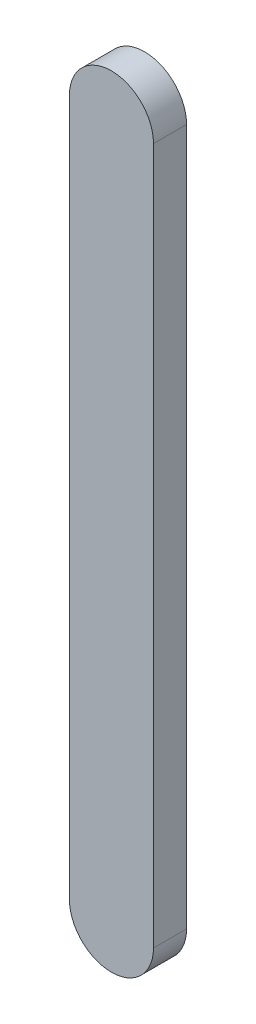
ISO-10303-21;
HEADER;
FILE_DESCRIPTION(('STEP AP214'),'2;1');
FILE_NAME('part.step','',(''),(''),'','','');
FILE_SCHEMA(('AUTOMOTIVE_DESIGN { 1 0 10303 214 1 1 1 1 }'));
ENDSEC;
DATA;
#1=APPLICATION_CONTEXT('core data for automotive mechanical design processes');
#2=APPLICATION_PROTOCOL_DEFINITION('international standard','automotive_design',2000,#1);
#3=PRODUCT_CONTEXT('',#1,'mechanical');
#4=PRODUCT('Part','Part','',(#3));
#5=PRODUCT_RELATED_PRODUCT_CATEGORY('part','',(#4));
#6=PRODUCT_DEFINITION_FORMATION('','',#4);
#7=PRODUCT_DEFINITION_CONTEXT('part definition',#1,'design');
#8=PRODUCT_DEFINITION('design','',#6,#7);
#9=PRODUCT_DEFINITION_SHAPE('','',#8);
#10=(LENGTH_UNIT() NAMED_UNIT(*) SI_UNIT(.MILLI.,.METRE.));
#11=(NAMED_UNIT(*) PLANE_ANGLE_UNIT() SI_UNIT($,.RADIAN.));
#12=(NAMED_UNIT(*) SI_UNIT($,.STERADIAN.) SOLID_ANGLE_UNIT());
#13=UNCERTAINTY_MEASURE_WITH_UNIT(LENGTH_MEASURE(1.E-05),#10,'distance_accuracy_value','');
#14=(GEOMETRIC_REPRESENTATION_CONTEXT(3) GLOBAL_UNCERTAINTY_ASSIGNED_CONTEXT((#13)) GLOBAL_UNIT_ASSIGNED_CONTEXT((#10,
#11,#12)) REPRESENTATION_CONTEXT('',''));
#15=CARTESIAN_POINT('',(0.,0.,0.));
#16=DIRECTION('',(0.,0.,1.));
#17=DIRECTION('',(1.,0.,0.));
#18=AXIS2_PLACEMENT_3D('',#15,#16,#17);
#19=CARTESIAN_POINT('',(147.574,67.437,0.));
#20=DIRECTION('',(-1.,0.,0.));
#21=DIRECTION('',(0.,1.,0.));
#22=AXIS2_PLACEMENT_3D('',#19,#20,#21);
#23=PLANE('',#22);
#24=DIRECTION('',(0.,1.,0.));
#25=VECTOR('',#24,1.);
#26=CARTESIAN_POINT('',(147.574,67.437,0.1999996));
#27=LINE('',#26,#25);
#28=CARTESIAN_POINT('',(147.574,67.437,0.1999996));
#29=VERTEX_POINT('',#28);
#30=CARTESIAN_POINT('',(147.574,71.6477104,0.1999996));
#31=VERTEX_POINT('',#30);
#32=EDGE_CURVE('E11',#29,#31,#27,.T.);
#33=ORIENTED_EDGE('',*,*,#32,.F.);
#34=DIRECTION('',(0.,0.,1.));
#35=VECTOR('',#34,1.);
#36=CARTESIAN_POINT('',(147.574,67.437,0.));
#37=LINE('',#36,#35);
#38=CARTESIAN_POINT('',(147.574,67.437,0.));
#39=VERTEX_POINT('',#38);
#40=EDGE_CURVE('E24',#39,#29,#37,.T.);
#41=ORIENTED_EDGE('',*,*,#40,.F.);
#42=DIRECTION('',(0.,1.,0.));
#43=VECTOR('',#42,1.);
#44=CARTESIAN_POINT('',(147.574,67.437,0.));
#45=LINE('',#44,#43);
#46=CARTESIAN_POINT('',(147.574,71.6477104,0.));
#47=VERTEX_POINT('',#46);
#48=EDGE_CURVE('E75',#39,#47,#45,.T.);
#49=ORIENTED_EDGE('',*,*,#48,.T.);
#50=DIRECTION('',(0.,0.,1.));
#51=VECTOR('',#50,1.);
#52=CARTESIAN_POINT('',(147.574,71.6477104,0.));
#53=LINE('',#52,#51);
#54=EDGE_CURVE('E37',#47,#31,#53,.T.);
#55=ORIENTED_EDGE('',*,*,#54,.T.);
#56=EDGE_LOOP('',(#33,#41,#49,#55));
#57=FACE_BOUND('',#56,.T.);
#58=ADVANCED_FACE('F17',(#57),#23,.F.);
#59=CARTESIAN_POINT('',(147.32,71.6477104,0.));
#60=DIRECTION('',(0.,0.,-1.));
#61=DIRECTION('',(1.,0.,0.));
#62=AXIS2_PLACEMENT_3D('',#59,#60,#61);
#63=CYLINDRICAL_SURFACE('',#62,0.254000000000005);
#64=CARTESIAN_POINT('',(147.32,71.6477104,0.1999996));
#65=DIRECTION('',(0.,0.,1.));
#66=DIRECTION('',(1.,0.,0.));
#67=AXIS2_PLACEMENT_3D('',#64,#65,#66);
#68=CIRCLE('',#67,0.254000000000005);
#69=CARTESIAN_POINT('',(147.066,71.6477104,0.1999996));
#70=VERTEX_POINT('',#69);
#71=EDGE_CURVE('E83',#31,#70,#68,.T.);
#72=ORIENTED_EDGE('',*,*,#71,.F.);
#73=ORIENTED_EDGE('',*,*,#54,.F.);
#74=CARTESIAN_POINT('',(147.32,71.6477104,0.));
#75=DIRECTION('',(0.,0.,1.));
#76=DIRECTION('',(1.,0.,0.));
#77=AXIS2_PLACEMENT_3D('',#74,#75,#76);
#78=CIRCLE('',#77,0.254000000000005);
#79=CARTESIAN_POINT('',(147.066,71.6477104,0.));
#80=VERTEX_POINT('',#79);
#81=EDGE_CURVE('E81',#47,#80,#78,.T.);
#82=ORIENTED_EDGE('',*,*,#81,.T.);
#83=DIRECTION('',(0.,0.,1.));
#84=VECTOR('',#83,1.);
#85=CARTESIAN_POINT('',(147.066,71.6477104,0.));
#86=LINE('',#85,#84);
#87=EDGE_CURVE('E67',#80,#70,#86,.T.);
#88=ORIENTED_EDGE('',*,*,#87,.T.);
#89=EDGE_LOOP('',(#72,#73,#82,#88));
#90=FACE_BOUND('',#89,.T.);
#91=ADVANCED_FACE('F89',(#90),#63,.T.);
#92=CARTESIAN_POINT('',(147.066,71.6477104,0.));
#93=DIRECTION('',(1.,0.,0.));
#94=DIRECTION('',(0.,-1.,0.));
#95=AXIS2_PLACEMENT_3D('',#92,#93,#94);
#96=PLANE('',#95);
#97=DIRECTION('',(0.,-1.,0.));
#98=VECTOR('',#97,1.);
#99=CARTESIAN_POINT('',(147.066,71.6477104,0.1999996));
#100=LINE('',#99,#98);
#101=CARTESIAN_POINT('',(147.066,67.437,0.1999996));
#102=VERTEX_POINT('',#101);
#103=EDGE_CURVE('E71',#70,#102,#100,.T.);
#104=ORIENTED_EDGE('',*,*,#103,.F.);
#105=ORIENTED_EDGE('',*,*,#87,.F.);
#106=DIRECTION('',(0.,-1.,0.));
#107=VECTOR('',#106,1.);
#108=CARTESIAN_POINT('',(147.066,71.6477104,0.));
#109=LINE('',#108,#107);
#110=CARTESIAN_POINT('',(147.066,67.437,0.));
#111=VERTEX_POINT('',#110);
#112=EDGE_CURVE('E63',#80,#111,#109,.T.);
#113=ORIENTED_EDGE('',*,*,#112,.T.);
#114=DIRECTION('',(0.,0.,1.));
#115=VECTOR('',#114,1.);
#116=CARTESIAN_POINT('',(147.066,67.437,0.));
#117=LINE('',#116,#115);
#118=EDGE_CURVE('E53',#111,#102,#117,.T.);
#119=ORIENTED_EDGE('',*,*,#118,.T.);
#120=EDGE_LOOP('',(#104,#105,#113,#119));
#121=FACE_BOUND('',#120,.T.);
#122=ADVANCED_FACE('F66',(#121),#96,.F.);
#123=CARTESIAN_POINT('',(147.32,67.437,0.));
#124=DIRECTION('',(0.,0.,-1.));
#125=DIRECTION('',(-1.,0.,0.));
#126=AXIS2_PLACEMENT_3D('',#123,#124,#125);
#127=CYLINDRICAL_SURFACE('',#126,0.254000000000005);
#128=CARTESIAN_POINT('',(147.32,67.437,0.1999996));
#129=DIRECTION('',(0.,0.,1.));
#130=DIRECTION('',(-1.,0.,0.));
#131=AXIS2_PLACEMENT_3D('',#128,#129,#130);
#132=CIRCLE('',#131,0.254000000000005);
#133=EDGE_CURVE('E59',#102,#29,#132,.T.);
#134=ORIENTED_EDGE('',*,*,#133,.F.);
#135=ORIENTED_EDGE('',*,*,#118,.F.);
#136=CARTESIAN_POINT('',(147.32,67.437,0.));
#137=DIRECTION('',(0.,0.,1.));
#138=DIRECTION('',(-1.,0.,0.));
#139=AXIS2_PLACEMENT_3D('',#136,#137,#138);
#140=CIRCLE('',#139,0.254000000000005);
#141=EDGE_CURVE('E57',#111,#39,#140,.T.);
#142=ORIENTED_EDGE('',*,*,#141,.T.);
#143=ORIENTED_EDGE('',*,*,#40,.T.);
#144=EDGE_LOOP('',(#134,#135,#142,#143));
#145=FACE_BOUND('',#144,.T.);
#146=ADVANCED_FACE('F55',(#145),#127,.T.);
#147=CARTESIAN_POINT('',(147.574,67.437,0.));
#148=DIRECTION('',(0.,0.,-1.));
#149=DIRECTION('',(-1.,0.,0.));
#150=AXIS2_PLACEMENT_3D('',#147,#148,#149);
#151=PLANE('',#150);
#152=ORIENTED_EDGE('',*,*,#141,.F.);
#153=ORIENTED_EDGE('',*,*,#112,.F.);
#154=ORIENTED_EDGE('',*,*,#81,.F.);
#155=ORIENTED_EDGE('',*,*,#48,.F.);
#156=EDGE_LOOP('',(#152,#153,#154,#155));
#157=FACE_BOUND('',#156,.T.);
#158=ADVANCED_FACE('F74',(#157),#151,.T.);
#159=CARTESIAN_POINT('',(147.574,67.437,0.1999996));
#160=DIRECTION('',(0.,0.,-1.));
#161=DIRECTION('',(-1.,0.,0.));
#162=AXIS2_PLACEMENT_3D('',#159,#160,#161);
#163=PLANE('',#162);
#164=ORIENTED_EDGE('',*,*,#32,.T.);
#165=ORIENTED_EDGE('',*,*,#71,.T.);
#166=ORIENTED_EDGE('',*,*,#103,.T.);
#167=ORIENTED_EDGE('',*,*,#133,.T.);
#168=EDGE_LOOP('',(#164,#165,#166,#167));
#169=FACE_BOUND('',#168,.T.);
#170=ADVANCED_FACE('F91',(#169),#163,.F.);
#171=CLOSED_SHELL('',(#58,#91,#122,#146,#158,#170));
#172=MANIFOLD_SOLID_BREP('B1',#171);
#173=ADVANCED_BREP_SHAPE_REPRESENTATION('',(#18,#172),#14);
#174=SHAPE_DEFINITION_REPRESENTATION(#9,#173);
ENDSEC;
END-ISO-10303-21;
